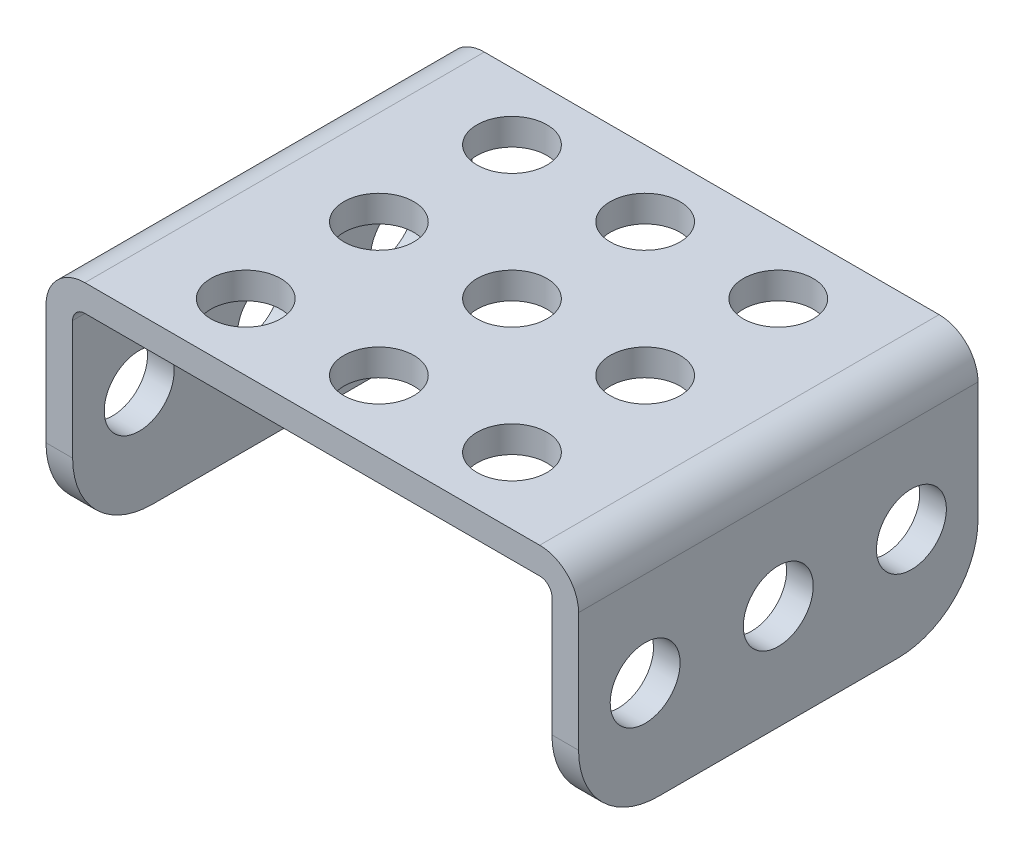
ISO-10303-21;
HEADER;
FILE_DESCRIPTION(('STEP AP214'),'2;1');
FILE_NAME('part.step','',(''),(''),'','','');
FILE_SCHEMA(('AUTOMOTIVE_DESIGN { 1 0 10303 214 1 1 1 1 }'));
ENDSEC;
DATA;
#1=APPLICATION_CONTEXT('core data for automotive mechanical design processes');
#2=APPLICATION_PROTOCOL_DEFINITION('international standard','automotive_design',2000,#1);
#3=PRODUCT_CONTEXT('',#1,'mechanical');
#4=PRODUCT('Part','Part','',(#3));
#5=PRODUCT_RELATED_PRODUCT_CATEGORY('part','',(#4));
#6=PRODUCT_DEFINITION_FORMATION('','',#4);
#7=PRODUCT_DEFINITION_CONTEXT('part definition',#1,'design');
#8=PRODUCT_DEFINITION('design','',#6,#7);
#9=PRODUCT_DEFINITION_SHAPE('','',#8);
#10=(LENGTH_UNIT() NAMED_UNIT(*) SI_UNIT(.MILLI.,.METRE.));
#11=(NAMED_UNIT(*) PLANE_ANGLE_UNIT() SI_UNIT($,.RADIAN.));
#12=(NAMED_UNIT(*) SI_UNIT($,.STERADIAN.) SOLID_ANGLE_UNIT());
#13=UNCERTAINTY_MEASURE_WITH_UNIT(LENGTH_MEASURE(1.E-05),#10,'distance_accuracy_value','');
#14=(GEOMETRIC_REPRESENTATION_CONTEXT(3) GLOBAL_UNCERTAINTY_ASSIGNED_CONTEXT((#13)) GLOBAL_UNIT_ASSIGNED_CONTEXT((#10,
#11,#12)) REPRESENTATION_CONTEXT('',''));
#15=CARTESIAN_POINT('',(0.,0.,0.));
#16=DIRECTION('',(0.,0.,1.));
#17=DIRECTION('',(1.,0.,0.));
#18=AXIS2_PLACEMENT_3D('',#15,#16,#17);
#19=CARTESIAN_POINT('',(0.863400000000006,-2.3366,0.));
#20=DIRECTION('',(0.,0.,1.));
#21=DIRECTION('',(1.,0.,0.));
#22=AXIS2_PLACEMENT_3D('',#19,#20,#21);
#23=CYLINDRICAL_SURFACE('',#22,0.7366);
#24=DIRECTION('',(0.,0.,1.));
#25=VECTOR('',#24,1.);
#26=CARTESIAN_POINT('',(0.863400000000005,-1.6,-25.6));
#27=LINE('',#26,#25);
#28=CARTESIAN_POINT('',(0.863400000000005,-1.6,-0.799999999999999));
#29=VERTEX_POINT('',#28);
#30=CARTESIAN_POINT('',(0.863400000000004,-1.6,-24.8));
#31=VERTEX_POINT('',#30);
#32=EDGE_CURVE('E138',#29,#31,#27,.F.);
#33=ORIENTED_EDGE('',*,*,#32,.T.);
#34=CARTESIAN_POINT('',(0.863400000000003,-2.3366,-24.8));
#35=DIRECTION('',(0.,0.,1.));
#36=DIRECTION('',(1.,0.,0.));
#37=AXIS2_PLACEMENT_3D('',#34,#35,#36);
#38=CIRCLE('',#37,0.7366);
#39=CARTESIAN_POINT('',(1.6,-2.3366,-24.8));
#40=VERTEX_POINT('',#39);
#41=EDGE_CURVE('E19',#40,#31,#38,.T.);
#42=ORIENTED_EDGE('',*,*,#41,.F.);
#43=DIRECTION('',(0.,0.,1.));
#44=VECTOR('',#43,1.);
#45=CARTESIAN_POINT('',(1.60000000000001,-2.3366,0.));
#46=LINE('',#45,#44);
#47=CARTESIAN_POINT('',(1.60000000000002,-2.3366,-0.799999999999999));
#48=VERTEX_POINT('',#47);
#49=EDGE_CURVE('E188',#40,#48,#46,.T.);
#50=ORIENTED_EDGE('',*,*,#49,.T.);
#51=CARTESIAN_POINT('',(0.863400000000006,-2.3366,-0.799999999999999));
#52=DIRECTION('',(0.,0.,1.));
#53=DIRECTION('',(1.,0.,0.));
#54=AXIS2_PLACEMENT_3D('',#51,#52,#53);
#55=CIRCLE('',#54,0.7366);
#56=EDGE_CURVE('E136',#29,#48,#55,.F.);
#57=ORIENTED_EDGE('',*,*,#56,.F.);
#58=EDGE_LOOP('',(#33,#42,#50,#57));
#59=FACE_BOUND('',#58,.T.);
#60=ADVANCED_FACE('F16',(#59),#23,.F.);
#61=CARTESIAN_POINT('',(-26.4634,-2.3366,-25.6));
#62=DIRECTION('',(0.,0.,-1.));
#63=DIRECTION('',(-1.,0.,0.));
#64=AXIS2_PLACEMENT_3D('',#61,#62,#63);
#65=CYLINDRICAL_SURFACE('',#64,0.736599999999997);
#66=DIRECTION('',(0.,0.,1.));
#67=VECTOR('',#66,1.);
#68=CARTESIAN_POINT('',(-27.2,-2.3366,-25.6));
#69=LINE('',#68,#67);
#70=CARTESIAN_POINT('',(-27.2,-2.3366,-0.799999999999999));
#71=VERTEX_POINT('',#70);
#72=CARTESIAN_POINT('',(-27.2,-2.3366,-24.8));
#73=VERTEX_POINT('',#72);
#74=EDGE_CURVE('E179',#71,#73,#69,.F.);
#75=ORIENTED_EDGE('',*,*,#74,.T.);
#76=CARTESIAN_POINT('',(-26.4634,-2.3366,-24.8));
#77=DIRECTION('',(0.,0.,-1.));
#78=DIRECTION('',(-1.,0.,0.));
#79=AXIS2_PLACEMENT_3D('',#76,#77,#78);
#80=CIRCLE('',#79,0.736599999999997);
#81=CARTESIAN_POINT('',(-26.4634,-1.6,-24.8));
#82=VERTEX_POINT('',#81);
#83=EDGE_CURVE('E325',#82,#73,#80,.F.);
#84=ORIENTED_EDGE('',*,*,#83,.F.);
#85=DIRECTION('',(0.,0.,1.));
#86=VECTOR('',#85,1.);
#87=CARTESIAN_POINT('',(-26.4634,-1.6,-25.6));
#88=LINE('',#87,#86);
#89=CARTESIAN_POINT('',(-26.4634,-1.6,-0.799999999999999));
#90=VERTEX_POINT('',#89);
#91=EDGE_CURVE('E142',#82,#90,#88,.T.);
#92=ORIENTED_EDGE('',*,*,#91,.T.);
#93=CARTESIAN_POINT('',(-26.4634,-2.3366,-0.799999999999999));
#94=DIRECTION('',(0.,0.,-1.));
#95=DIRECTION('',(-1.,0.,0.));
#96=AXIS2_PLACEMENT_3D('',#93,#94,#95);
#97=CIRCLE('',#96,0.736599999999997);
#98=EDGE_CURVE('E209',#71,#90,#97,.T.);
#99=ORIENTED_EDGE('',*,*,#98,.F.);
#100=EDGE_LOOP('',(#75,#84,#92,#99));
#101=FACE_BOUND('',#100,.T.);
#102=ADVANCED_FACE('F708',(#101),#65,.F.);
#103=CARTESIAN_POINT('',(3.20000000000007,-8.00000000000012,-12.8));
#104=DIRECTION('',(-1.,0.,0.));
#105=DIRECTION('',(0.,-1.,0.));
#106=AXIS2_PLACEMENT_3D('',#103,#104,#105);
#107=CYLINDRICAL_SURFACE('',#106,2.1);
#108=CARTESIAN_POINT('',(-27.2,-8.00000000000001,-12.8));
#109=DIRECTION('',(-1.,0.,0.));
#110=DIRECTION('',(0.,-1.,0.));
#111=AXIS2_PLACEMENT_3D('',#108,#109,#110);
#112=CIRCLE('',#111,2.1);
#113=CARTESIAN_POINT('',(-27.2,-10.1,-12.8));
#114=VERTEX_POINT('',#113);
#115=EDGE_CURVE('E306',#114,#114,#112,.F.);
#116=ORIENTED_EDGE('',*,*,#115,.T.);
#117=EDGE_LOOP('',(#116));
#118=FACE_BOUND('',#117,.T.);
#119=CARTESIAN_POINT('',(-28.8,-8.,-12.8));
#120=DIRECTION('',(-1.,0.,0.));
#121=DIRECTION('',(0.,-1.,0.));
#122=AXIS2_PLACEMENT_3D('',#119,#120,#121);
#123=CIRCLE('',#122,2.1);
#124=CARTESIAN_POINT('',(-28.8,-10.1,-12.8));
#125=VERTEX_POINT('',#124);
#126=EDGE_CURVE('E297',#125,#125,#123,.F.);
#127=ORIENTED_EDGE('',*,*,#126,.F.);
#128=EDGE_LOOP('',(#127));
#129=FACE_BOUND('',#128,.T.);
#130=ADVANCED_FACE('F699',(#118,#129),#107,.F.);
#131=CARTESIAN_POINT('',(3.20000000000007,-8.00000000000012,-4.80000000000002));
#132=DIRECTION('',(-1.,0.,0.));
#133=DIRECTION('',(0.,-1.,0.));
#134=AXIS2_PLACEMENT_3D('',#131,#132,#133);
#135=CYLINDRICAL_SURFACE('',#134,2.1);
#136=CARTESIAN_POINT('',(-27.2,-8.00000000000001,-4.80000000000001));
#137=DIRECTION('',(-1.,0.,0.));
#138=DIRECTION('',(0.,-1.,0.));
#139=AXIS2_PLACEMENT_3D('',#136,#137,#138);
#140=CIRCLE('',#139,2.1);
#141=CARTESIAN_POINT('',(-27.2,-10.1,-4.80000000000001));
#142=VERTEX_POINT('',#141);
#143=EDGE_CURVE('E303',#142,#142,#140,.F.);
#144=ORIENTED_EDGE('',*,*,#143,.T.);
#145=EDGE_LOOP('',(#144));
#146=FACE_BOUND('',#145,.T.);
#147=CARTESIAN_POINT('',(-28.8,-8.00000000000001,-4.80000000000001));
#148=DIRECTION('',(-1.,0.,0.));
#149=DIRECTION('',(0.,-1.,0.));
#150=AXIS2_PLACEMENT_3D('',#147,#148,#149);
#151=CIRCLE('',#150,2.1);
#152=CARTESIAN_POINT('',(-28.8,-10.1,-4.80000000000001));
#153=VERTEX_POINT('',#152);
#154=EDGE_CURVE('E294',#153,#153,#151,.F.);
#155=ORIENTED_EDGE('',*,*,#154,.F.);
#156=EDGE_LOOP('',(#155));
#157=FACE_BOUND('',#156,.T.);
#158=ADVANCED_FACE('F690',(#146,#157),#135,.F.);
#159=CARTESIAN_POINT('',(3.20000000000007,-8.00000000000012,-20.8));
#160=DIRECTION('',(-1.,0.,0.));
#161=DIRECTION('',(0.,-1.,0.));
#162=AXIS2_PLACEMENT_3D('',#159,#160,#161);
#163=CYLINDRICAL_SURFACE('',#162,2.1);
#164=CARTESIAN_POINT('',(-27.2,-8.00000000000001,-20.8));
#165=DIRECTION('',(-1.,0.,0.));
#166=DIRECTION('',(0.,-1.,0.));
#167=AXIS2_PLACEMENT_3D('',#164,#165,#166);
#168=CIRCLE('',#167,2.1);
#169=CARTESIAN_POINT('',(-27.2,-10.1,-20.8));
#170=VERTEX_POINT('',#169);
#171=EDGE_CURVE('E300',#170,#170,#168,.F.);
#172=ORIENTED_EDGE('',*,*,#171,.T.);
#173=EDGE_LOOP('',(#172));
#174=FACE_BOUND('',#173,.T.);
#175=CARTESIAN_POINT('',(-28.8,-8.00000000000001,-20.8));
#176=DIRECTION('',(-1.,0.,0.));
#177=DIRECTION('',(0.,-1.,0.));
#178=AXIS2_PLACEMENT_3D('',#175,#176,#177);
#179=CIRCLE('',#178,2.1);
#180=CARTESIAN_POINT('',(-28.8,-10.1,-20.8));
#181=VERTEX_POINT('',#180);
#182=EDGE_CURVE('E291',#181,#181,#179,.F.);
#183=ORIENTED_EDGE('',*,*,#182,.F.);
#184=EDGE_LOOP('',(#183));
#185=FACE_BOUND('',#184,.T.);
#186=ADVANCED_FACE('F681',(#174,#185),#163,.F.);
#187=CARTESIAN_POINT('',(-28.8,-9.5,-20.));
#188=DIRECTION('',(-1.,0.,0.));
#189=DIRECTION('',(0.,-1.,0.));
#190=AXIS2_PLACEMENT_3D('',#187,#188,#189);
#191=CYLINDRICAL_SURFACE('',#190,4.8);
#192=CARTESIAN_POINT('',(-28.8,-9.5,-20.));
#193=DIRECTION('',(-1.,0.,0.));
#194=DIRECTION('',(0.,-1.,0.));
#195=AXIS2_PLACEMENT_3D('',#192,#193,#194);
#196=CIRCLE('',#195,4.8);
#197=CARTESIAN_POINT('',(-28.8,-9.5,-24.8));
#198=VERTEX_POINT('',#197);
#199=CARTESIAN_POINT('',(-28.8000000000001,-14.3,-20.));
#200=VERTEX_POINT('',#199);
#201=EDGE_CURVE('E175',#198,#200,#196,.T.);
#202=ORIENTED_EDGE('',*,*,#201,.F.);
#203=DIRECTION('',(-1.,0.,0.));
#204=VECTOR('',#203,1.);
#205=CARTESIAN_POINT('',(-28.8,-9.5,-24.8));
#206=LINE('',#205,#204);
#207=CARTESIAN_POINT('',(-27.2,-9.50000000000001,-24.8));
#208=VERTEX_POINT('',#207);
#209=EDGE_CURVE('E207',#198,#208,#206,.F.);
#210=ORIENTED_EDGE('',*,*,#209,.T.);
#211=CARTESIAN_POINT('',(-27.2,-9.50000000000001,-20.));
#212=DIRECTION('',(-1.,0.,0.));
#213=DIRECTION('',(0.,-1.,0.));
#214=AXIS2_PLACEMENT_3D('',#211,#212,#213);
#215=CIRCLE('',#214,4.8);
#216=CARTESIAN_POINT('',(-27.2,-14.3,-20.));
#217=VERTEX_POINT('',#216);
#218=EDGE_CURVE('E181',#208,#217,#215,.T.);
#219=ORIENTED_EDGE('',*,*,#218,.T.);
#220=DIRECTION('',(1.,0.,0.));
#221=VECTOR('',#220,1.);
#222=CARTESIAN_POINT('',(-28.8,-14.3,-20.));
#223=LINE('',#222,#221);
#224=EDGE_CURVE('E203',#200,#217,#223,.T.);
#225=ORIENTED_EDGE('',*,*,#224,.F.);
#226=EDGE_LOOP('',(#202,#210,#219,#225));
#227=FACE_BOUND('',#226,.T.);
#228=ADVANCED_FACE('F672',(#227),#191,.T.);
#229=CARTESIAN_POINT('',(-28.8,-14.3,-25.6));
#230=DIRECTION('',(0.,-1.,0.));
#231=DIRECTION('',(1.,0.,0.));
#232=AXIS2_PLACEMENT_3D('',#229,#230,#231);
#233=PLANE('',#232);
#234=DIRECTION('',(0.,0.,1.));
#235=VECTOR('',#234,1.);
#236=CARTESIAN_POINT('',(-28.8000000000001,-14.3,-25.6));
#237=LINE('',#236,#235);
#238=CARTESIAN_POINT('',(-28.8,-14.3,-5.6));
#239=VERTEX_POINT('',#238);
#240=EDGE_CURVE('E171',#200,#239,#237,.T.);
#241=ORIENTED_EDGE('',*,*,#240,.F.);
#242=ORIENTED_EDGE('',*,*,#224,.T.);
#243=DIRECTION('',(0.,0.,1.));
#244=VECTOR('',#243,1.);
#245=CARTESIAN_POINT('',(-27.2,-14.3,-25.6));
#246=LINE('',#245,#244);
#247=CARTESIAN_POINT('',(-27.2,-14.3,-5.6));
#248=VERTEX_POINT('',#247);
#249=EDGE_CURVE('E176',#217,#248,#246,.T.);
#250=ORIENTED_EDGE('',*,*,#249,.T.);
#251=DIRECTION('',(-1.,0.,0.));
#252=VECTOR('',#251,1.);
#253=CARTESIAN_POINT('',(-28.8,-14.3,-5.6));
#254=LINE('',#253,#252);
#255=EDGE_CURVE('E200',#239,#248,#254,.F.);
#256=ORIENTED_EDGE('',*,*,#255,.F.);
#257=EDGE_LOOP('',(#241,#242,#250,#256));
#258=FACE_BOUND('',#257,.T.);
#259=ADVANCED_FACE('F663',(#258),#233,.T.);
#260=CARTESIAN_POINT('',(-28.8,-9.5,-5.6));
#261=DIRECTION('',(-1.,0.,0.));
#262=DIRECTION('',(0.,-1.,0.));
#263=AXIS2_PLACEMENT_3D('',#260,#261,#262);
#264=CYLINDRICAL_SURFACE('',#263,4.8);
#265=CARTESIAN_POINT('',(-28.8,-9.5,-5.6));
#266=DIRECTION('',(-1.,0.,0.));
#267=DIRECTION('',(0.,-1.,0.));
#268=AXIS2_PLACEMENT_3D('',#265,#266,#267);
#269=CIRCLE('',#268,4.8);
#270=CARTESIAN_POINT('',(-28.8,-9.5,-0.8));
#271=VERTEX_POINT('',#270);
#272=EDGE_CURVE('E174',#239,#271,#269,.T.);
#273=ORIENTED_EDGE('',*,*,#272,.F.);
#274=ORIENTED_EDGE('',*,*,#255,.T.);
#275=CARTESIAN_POINT('',(-27.2,-9.50000000000001,-5.6));
#276=DIRECTION('',(-1.,0.,0.));
#277=DIRECTION('',(0.,-1.,0.));
#278=AXIS2_PLACEMENT_3D('',#275,#276,#277);
#279=CIRCLE('',#278,4.8);
#280=CARTESIAN_POINT('',(-27.2,-9.50000000000001,-0.8));
#281=VERTEX_POINT('',#280);
#282=EDGE_CURVE('E178',#248,#281,#279,.T.);
#283=ORIENTED_EDGE('',*,*,#282,.T.);
#284=DIRECTION('',(-1.,0.,0.));
#285=VECTOR('',#284,1.);
#286=CARTESIAN_POINT('',(-28.8,-9.5,-0.8));
#287=LINE('',#286,#285);
#288=EDGE_CURVE('E201',#281,#271,#287,.T.);
#289=ORIENTED_EDGE('',*,*,#288,.T.);
#290=EDGE_LOOP('',(#273,#274,#283,#289));
#291=FACE_BOUND('',#290,.T.);
#292=ADVANCED_FACE('F654',(#291),#264,.T.);
#293=CARTESIAN_POINT('',(3.20000000000007,-8.00000000000012,-12.8));
#294=DIRECTION('',(-1.,0.,0.));
#295=DIRECTION('',(0.,-1.,0.));
#296=AXIS2_PLACEMENT_3D('',#293,#294,#295);
#297=CYLINDRICAL_SURFACE('',#296,2.1);
#298=CARTESIAN_POINT('',(1.60000000000004,-8.00000000000012,-12.8));
#299=DIRECTION('',(-1.,0.,0.));
#300=DIRECTION('',(0.,-1.,0.));
#301=AXIS2_PLACEMENT_3D('',#298,#299,#300);
#302=CIRCLE('',#301,2.1);
#303=CARTESIAN_POINT('',(1.60000000000003,-10.1000000000001,-12.8));
#304=VERTEX_POINT('',#303);
#305=EDGE_CURVE('E318',#304,#304,#302,.T.);
#306=ORIENTED_EDGE('',*,*,#305,.T.);
#307=EDGE_LOOP('',(#306));
#308=FACE_BOUND('',#307,.T.);
#309=CARTESIAN_POINT('',(3.20000000000007,-8.00000000000012,-12.8));
#310=DIRECTION('',(-1.,0.,0.));
#311=DIRECTION('',(0.,-1.,0.));
#312=AXIS2_PLACEMENT_3D('',#309,#310,#311);
#313=CIRCLE('',#312,2.1);
#314=CARTESIAN_POINT('',(3.20000000000006,-10.1000000000001,-12.8));
#315=VERTEX_POINT('',#314);
#316=EDGE_CURVE('E284',#315,#315,#313,.T.);
#317=ORIENTED_EDGE('',*,*,#316,.F.);
#318=EDGE_LOOP('',(#317));
#319=FACE_BOUND('',#318,.T.);
#320=ADVANCED_FACE('F645',(#308,#319),#297,.F.);
#321=CARTESIAN_POINT('',(3.20000000000007,-8.00000000000012,-4.80000000000002));
#322=DIRECTION('',(-1.,0.,0.));
#323=DIRECTION('',(0.,-1.,0.));
#324=AXIS2_PLACEMENT_3D('',#321,#322,#323);
#325=CYLINDRICAL_SURFACE('',#324,2.1);
#326=CARTESIAN_POINT('',(1.60000000000004,-8.00000000000012,-4.80000000000002));
#327=DIRECTION('',(-1.,0.,0.));
#328=DIRECTION('',(0.,-1.,0.));
#329=AXIS2_PLACEMENT_3D('',#326,#327,#328);
#330=CIRCLE('',#329,2.1);
#331=CARTESIAN_POINT('',(1.60000000000003,-10.1000000000001,-4.80000000000002));
#332=VERTEX_POINT('',#331);
#333=EDGE_CURVE('E315',#332,#332,#330,.T.);
#334=ORIENTED_EDGE('',*,*,#333,.T.);
#335=EDGE_LOOP('',(#334));
#336=FACE_BOUND('',#335,.T.);
#337=CARTESIAN_POINT('',(3.20000000000007,-8.00000000000012,-4.80000000000002));
#338=DIRECTION('',(-1.,0.,0.));
#339=DIRECTION('',(0.,-1.,0.));
#340=AXIS2_PLACEMENT_3D('',#337,#338,#339);
#341=CIRCLE('',#340,2.1);
#342=CARTESIAN_POINT('',(3.20000000000007,-10.1000000000001,-4.80000000000002));
#343=VERTEX_POINT('',#342);
#344=EDGE_CURVE('E281',#343,#343,#341,.T.);
#345=ORIENTED_EDGE('',*,*,#344,.F.);
#346=EDGE_LOOP('',(#345));
#347=FACE_BOUND('',#346,.T.);
#348=ADVANCED_FACE('F636',(#336,#347),#325,.F.);
#349=CARTESIAN_POINT('',(3.20000000000007,-8.00000000000012,-20.8));
#350=DIRECTION('',(-1.,0.,0.));
#351=DIRECTION('',(0.,-1.,0.));
#352=AXIS2_PLACEMENT_3D('',#349,#350,#351);
#353=CYLINDRICAL_SURFACE('',#352,2.1);
#354=CARTESIAN_POINT('',(1.60000000000004,-8.00000000000012,-20.8));
#355=DIRECTION('',(-1.,0.,0.));
#356=DIRECTION('',(0.,-1.,0.));
#357=AXIS2_PLACEMENT_3D('',#354,#355,#356);
#358=CIRCLE('',#357,2.1);
#359=CARTESIAN_POINT('',(1.60000000000003,-10.1000000000001,-20.8));
#360=VERTEX_POINT('',#359);
#361=EDGE_CURVE('E143',#360,#360,#358,.T.);
#362=ORIENTED_EDGE('',*,*,#361,.T.);
#363=EDGE_LOOP('',(#362));
#364=FACE_BOUND('',#363,.T.);
#365=CARTESIAN_POINT('',(3.20000000000007,-8.00000000000012,-20.8));
#366=DIRECTION('',(-1.,0.,0.));
#367=DIRECTION('',(0.,-1.,0.));
#368=AXIS2_PLACEMENT_3D('',#365,#366,#367);
#369=CIRCLE('',#368,2.1);
#370=CARTESIAN_POINT('',(3.20000000000006,-10.1000000000001,-20.8));
#371=VERTEX_POINT('',#370);
#372=EDGE_CURVE('E278',#371,#371,#369,.T.);
#373=ORIENTED_EDGE('',*,*,#372,.F.);
#374=EDGE_LOOP('',(#373));
#375=FACE_BOUND('',#374,.T.);
#376=ADVANCED_FACE('F628',(#364,#375),#353,.F.);
#377=CARTESIAN_POINT('',(3.20000000000003,-9.5,-5.6));
#378=DIRECTION('',(1.,0.,0.));
#379=DIRECTION('',(0.,1.,0.));
#380=AXIS2_PLACEMENT_3D('',#377,#378,#379);
#381=CYLINDRICAL_SURFACE('',#380,4.8);
#382=CARTESIAN_POINT('',(3.20000000000003,-9.5,-5.6));
#383=DIRECTION('',(1.,0.,0.));
#384=DIRECTION('',(0.,1.,0.));
#385=AXIS2_PLACEMENT_3D('',#382,#383,#384);
#386=CIRCLE('',#385,4.8);
#387=CARTESIAN_POINT('',(3.20000000000002,-9.5,-0.799999999999998));
#388=VERTEX_POINT('',#387);
#389=CARTESIAN_POINT('',(3.20000000000005,-14.3,-5.6));
#390=VERTEX_POINT('',#389);
#391=EDGE_CURVE('E161',#388,#390,#386,.T.);
#392=ORIENTED_EDGE('',*,*,#391,.F.);
#393=DIRECTION('',(1.,0.,0.));
#394=VECTOR('',#393,1.);
#395=CARTESIAN_POINT('',(3.20000000000003,-9.5,-0.799999999999998));
#396=LINE('',#395,#394);
#397=CARTESIAN_POINT('',(1.60000000000003,-9.50000000000001,-0.799999999999998));
#398=VERTEX_POINT('',#397);
#399=EDGE_CURVE('E198',#388,#398,#396,.F.);
#400=ORIENTED_EDGE('',*,*,#399,.T.);
#401=CARTESIAN_POINT('',(1.60000000000003,-9.50000000000001,-5.6));
#402=DIRECTION('',(1.,0.,0.));
#403=DIRECTION('',(0.,1.,0.));
#404=AXIS2_PLACEMENT_3D('',#401,#402,#403);
#405=CIRCLE('',#404,4.8);
#406=CARTESIAN_POINT('',(1.60000000000005,-14.3,-5.6));
#407=VERTEX_POINT('',#406);
#408=EDGE_CURVE('E187',#398,#407,#405,.T.);
#409=ORIENTED_EDGE('',*,*,#408,.T.);
#410=DIRECTION('',(1.,0.,0.));
#411=VECTOR('',#410,1.);
#412=CARTESIAN_POINT('',(3.20000000000005,-14.3,-5.6));
#413=LINE('',#412,#411);
#414=EDGE_CURVE('E195',#390,#407,#413,.F.);
#415=ORIENTED_EDGE('',*,*,#414,.F.);
#416=EDGE_LOOP('',(#392,#400,#409,#415));
#417=FACE_BOUND('',#416,.T.);
#418=ADVANCED_FACE('F375',(#417),#381,.T.);
#419=CARTESIAN_POINT('',(3.20000000000005,-14.3,0.));
#420=DIRECTION('',(0.,-1.,0.));
#421=DIRECTION('',(1.,0.,0.));
#422=AXIS2_PLACEMENT_3D('',#419,#420,#421);
#423=PLANE('',#422);
#424=DIRECTION('',(0.,0.,1.));
#425=VECTOR('',#424,1.);
#426=CARTESIAN_POINT('',(1.60000000000005,-14.3,0.));
#427=LINE('',#426,#425);
#428=CARTESIAN_POINT('',(1.60000000000005,-14.3,-20.));
#429=VERTEX_POINT('',#428);
#430=EDGE_CURVE('E184',#407,#429,#427,.F.);
#431=ORIENTED_EDGE('',*,*,#430,.T.);
#432=DIRECTION('',(-1.,0.,0.));
#433=VECTOR('',#432,1.);
#434=CARTESIAN_POINT('',(3.20000000000005,-14.3,-20.));
#435=LINE('',#434,#433);
#436=CARTESIAN_POINT('',(3.20000000000003,-14.3,-20.));
#437=VERTEX_POINT('',#436);
#438=EDGE_CURVE('E192',#437,#429,#435,.T.);
#439=ORIENTED_EDGE('',*,*,#438,.F.);
#440=DIRECTION('',(0.,0.,1.));
#441=VECTOR('',#440,1.);
#442=CARTESIAN_POINT('',(3.20000000000005,-14.3,0.));
#443=LINE('',#442,#441);
#444=EDGE_CURVE('E157',#390,#437,#443,.F.);
#445=ORIENTED_EDGE('',*,*,#444,.F.);
#446=ORIENTED_EDGE('',*,*,#414,.T.);
#447=EDGE_LOOP('',(#431,#439,#445,#446));
#448=FACE_BOUND('',#447,.T.);
#449=ADVANCED_FACE('F378',(#448),#423,.T.);
#450=CARTESIAN_POINT('',(3.20000000000003,-9.5,-20.));
#451=DIRECTION('',(-1.,0.,0.));
#452=DIRECTION('',(0.,-1.,0.));
#453=AXIS2_PLACEMENT_3D('',#450,#451,#452);
#454=CYLINDRICAL_SURFACE('',#453,4.8);
#455=CARTESIAN_POINT('',(1.60000000000003,-9.50000000000001,-20.));
#456=DIRECTION('',(-1.,0.,0.));
#457=DIRECTION('',(0.,-1.,0.));
#458=AXIS2_PLACEMENT_3D('',#455,#456,#457);
#459=CIRCLE('',#458,4.8);
#460=CARTESIAN_POINT('',(1.60000000000002,-9.50000000000001,-24.8));
#461=VERTEX_POINT('',#460);
#462=EDGE_CURVE('E186',#429,#461,#459,.F.);
#463=ORIENTED_EDGE('',*,*,#462,.T.);
#464=DIRECTION('',(-1.,0.,0.));
#465=VECTOR('',#464,1.);
#466=CARTESIAN_POINT('',(3.20000000000003,-9.5,-24.8));
#467=LINE('',#466,#465);
#468=CARTESIAN_POINT('',(3.2,-9.5,-24.8));
#469=VERTEX_POINT('',#468);
#470=EDGE_CURVE('E190',#461,#469,#467,.F.);
#471=ORIENTED_EDGE('',*,*,#470,.T.);
#472=CARTESIAN_POINT('',(3.2,-9.5,-20.));
#473=DIRECTION('',(-1.,0.,0.));
#474=DIRECTION('',(0.,-1.,0.));
#475=AXIS2_PLACEMENT_3D('',#472,#473,#474);
#476=CIRCLE('',#475,4.8);
#477=EDGE_CURVE('E160',#437,#469,#476,.F.);
#478=ORIENTED_EDGE('',*,*,#477,.F.);
#479=ORIENTED_EDGE('',*,*,#438,.T.);
#480=EDGE_LOOP('',(#463,#471,#478,#479));
#481=FACE_BOUND('',#480,.T.);
#482=ADVANCED_FACE('F381',(#481),#454,.T.);
#483=CARTESIAN_POINT('',(1.6,-1.6,0.));
#484=DIRECTION('',(1.,0.,0.));
#485=DIRECTION('',(0.,1.,0.));
#486=AXIS2_PLACEMENT_3D('',#483,#484,#485);
#487=PLANE('',#486);
#488=ORIENTED_EDGE('',*,*,#361,.F.);
#489=EDGE_LOOP('',(#488));
#490=FACE_BOUND('',#489,.T.);
#491=ORIENTED_EDGE('',*,*,#333,.F.);
#492=EDGE_LOOP('',(#491));
#493=FACE_BOUND('',#492,.T.);
#494=ORIENTED_EDGE('',*,*,#305,.F.);
#495=EDGE_LOOP('',(#494));
#496=FACE_BOUND('',#495,.T.);
#497=ORIENTED_EDGE('',*,*,#430,.F.);
#498=ORIENTED_EDGE('',*,*,#408,.F.);
#499=DIRECTION('',(0.,1.,0.));
#500=VECTOR('',#499,1.);
#501=CARTESIAN_POINT('',(1.60000000000003,-14.3,-0.799999999999999));
#502=LINE('',#501,#500);
#503=EDGE_CURVE('E169',#398,#48,#502,.T.);
#504=ORIENTED_EDGE('',*,*,#503,.T.);
#505=ORIENTED_EDGE('',*,*,#49,.F.);
#506=DIRECTION('',(0.,1.,0.));
#507=VECTOR('',#506,1.);
#508=CARTESIAN_POINT('',(1.6,-14.3,-24.8));
#509=LINE('',#508,#507);
#510=EDGE_CURVE('E135',#40,#461,#509,.F.);
#511=ORIENTED_EDGE('',*,*,#510,.T.);
#512=ORIENTED_EDGE('',*,*,#462,.F.);
#513=EDGE_LOOP('',(#497,#498,#504,#505,#511,#512));
#514=FACE_BOUND('',#513,.T.);
#515=ADVANCED_FACE('F333',(#490,#493,#496,#514),#487,.F.);
#516=CARTESIAN_POINT('',(0.,-1.6,-25.6));
#517=DIRECTION('',(0.,1.,0.));
#518=DIRECTION('',(0.,0.,1.));
#519=AXIS2_PLACEMENT_3D('',#516,#517,#518);
#520=PLANE('',#519);
#521=CARTESIAN_POINT('',(-4.8,-1.6,-20.8));
#522=DIRECTION('',(0.,1.,0.));
#523=DIRECTION('',(0.,0.,1.));
#524=AXIS2_PLACEMENT_3D('',#521,#522,#523);
#525=CIRCLE('',#524,2.09999999999999);
#526=CARTESIAN_POINT('',(-4.8,-1.6,-18.7));
#527=VERTEX_POINT('',#526);
#528=EDGE_CURVE('E153',#527,#527,#525,.T.);
#529=ORIENTED_EDGE('',*,*,#528,.T.);
#530=EDGE_LOOP('',(#529));
#531=FACE_BOUND('',#530,.T.);
#532=CARTESIAN_POINT('',(-4.8,-1.6,-12.8));
#533=DIRECTION('',(0.,1.,0.));
#534=DIRECTION('',(0.,0.,1.));
#535=AXIS2_PLACEMENT_3D('',#532,#533,#534);
#536=CIRCLE('',#535,2.09999999999999);
#537=CARTESIAN_POINT('',(-4.8,-1.6,-10.7));
#538=VERTEX_POINT('',#537);
#539=EDGE_CURVE('E250',#538,#538,#536,.T.);
#540=ORIENTED_EDGE('',*,*,#539,.T.);
#541=EDGE_LOOP('',(#540));
#542=FACE_BOUND('',#541,.T.);
#543=CARTESIAN_POINT('',(-4.8,-1.6,-4.8));
#544=DIRECTION('',(0.,1.,0.));
#545=DIRECTION('',(0.,0.,1.));
#546=AXIS2_PLACEMENT_3D('',#543,#544,#545);
#547=CIRCLE('',#546,2.09999999999999);
#548=CARTESIAN_POINT('',(-4.8,-1.6,-2.70000000000001));
#549=VERTEX_POINT('',#548);
#550=EDGE_CURVE('E253',#549,#549,#547,.T.);
#551=ORIENTED_EDGE('',*,*,#550,.T.);
#552=EDGE_LOOP('',(#551));
#553=FACE_BOUND('',#552,.T.);
#554=CARTESIAN_POINT('',(-12.8,-1.6,-20.8));
#555=DIRECTION('',(0.,1.,0.));
#556=DIRECTION('',(0.,0.,1.));
#557=AXIS2_PLACEMENT_3D('',#554,#555,#556);
#558=CIRCLE('',#557,2.09999999999999);
#559=CARTESIAN_POINT('',(-12.8,-1.6,-18.7));
#560=VERTEX_POINT('',#559);
#561=EDGE_CURVE('E256',#560,#560,#558,.T.);
#562=ORIENTED_EDGE('',*,*,#561,.T.);
#563=EDGE_LOOP('',(#562));
#564=FACE_BOUND('',#563,.T.);
#565=CARTESIAN_POINT('',(-12.8,-1.6,-12.8));
#566=DIRECTION('',(0.,1.,0.));
#567=DIRECTION('',(0.,0.,1.));
#568=AXIS2_PLACEMENT_3D('',#565,#566,#567);
#569=CIRCLE('',#568,2.09999999999999);
#570=CARTESIAN_POINT('',(-12.8,-1.6,-10.7));
#571=VERTEX_POINT('',#570);
#572=EDGE_CURVE('E259',#571,#571,#569,.T.);
#573=ORIENTED_EDGE('',*,*,#572,.T.);
#574=EDGE_LOOP('',(#573));
#575=FACE_BOUND('',#574,.T.);
#576=CARTESIAN_POINT('',(-12.8,-1.6,-4.8));
#577=DIRECTION('',(0.,1.,0.));
#578=DIRECTION('',(0.,0.,1.));
#579=AXIS2_PLACEMENT_3D('',#576,#577,#578);
#580=CIRCLE('',#579,2.09999999999999);
#581=CARTESIAN_POINT('',(-12.8,-1.6,-2.70000000000001));
#582=VERTEX_POINT('',#581);
#583=EDGE_CURVE('E262',#582,#582,#580,.T.);
#584=ORIENTED_EDGE('',*,*,#583,.T.);
#585=EDGE_LOOP('',(#584));
#586=FACE_BOUND('',#585,.T.);
#587=CARTESIAN_POINT('',(-20.8,-1.6,-20.8));
#588=DIRECTION('',(0.,1.,0.));
#589=DIRECTION('',(0.,0.,1.));
#590=AXIS2_PLACEMENT_3D('',#587,#588,#589);
#591=CIRCLE('',#590,2.09999999999999);
#592=CARTESIAN_POINT('',(-20.8,-1.6,-18.7));
#593=VERTEX_POINT('',#592);
#594=EDGE_CURVE('E265',#593,#593,#591,.T.);
#595=ORIENTED_EDGE('',*,*,#594,.T.);
#596=EDGE_LOOP('',(#595));
#597=FACE_BOUND('',#596,.T.);
#598=CARTESIAN_POINT('',(-20.8,-1.6,-12.8));
#599=DIRECTION('',(0.,1.,0.));
#600=DIRECTION('',(0.,0.,1.));
#601=AXIS2_PLACEMENT_3D('',#598,#599,#600);
#602=CIRCLE('',#601,2.09999999999999);
#603=CARTESIAN_POINT('',(-20.8,-1.6,-10.7));
#604=VERTEX_POINT('',#603);
#605=EDGE_CURVE('E268',#604,#604,#602,.T.);
#606=ORIENTED_EDGE('',*,*,#605,.T.);
#607=EDGE_LOOP('',(#606));
#608=FACE_BOUND('',#607,.T.);
#609=CARTESIAN_POINT('',(-20.8,-1.6,-4.8));
#610=DIRECTION('',(0.,1.,0.));
#611=DIRECTION('',(0.,0.,1.));
#612=AXIS2_PLACEMENT_3D('',#609,#610,#611);
#613=CIRCLE('',#612,2.09999999999999);
#614=CARTESIAN_POINT('',(-20.8,-1.6,-2.70000000000001));
#615=VERTEX_POINT('',#614);
#616=EDGE_CURVE('E271',#615,#615,#613,.T.);
#617=ORIENTED_EDGE('',*,*,#616,.T.);
#618=EDGE_LOOP('',(#617));
#619=FACE_BOUND('',#618,.T.);
#620=ORIENTED_EDGE('',*,*,#91,.F.);
#621=DIRECTION('',(1.,0.,0.));
#622=VECTOR('',#621,1.);
#623=CARTESIAN_POINT('',(-28.8,-1.6,-24.8));
#624=LINE('',#623,#622);
#625=EDGE_CURVE('E133',#82,#31,#624,.T.);
#626=ORIENTED_EDGE('',*,*,#625,.T.);
#627=ORIENTED_EDGE('',*,*,#32,.F.);
#628=DIRECTION('',(-1.,0.,0.));
#629=VECTOR('',#628,1.);
#630=CARTESIAN_POINT('',(-28.8,-1.6,-0.8));
#631=LINE('',#630,#629);
#632=EDGE_CURVE('E329',#29,#90,#631,.T.);
#633=ORIENTED_EDGE('',*,*,#632,.T.);
#634=EDGE_LOOP('',(#620,#626,#627,#633));
#635=FACE_BOUND('',#634,.T.);
#636=ADVANCED_FACE('F146',(#531,#542,#553,#564,#575,#586,#597,#608,#619,#635),#520,.F.);
#637=CARTESIAN_POINT('',(-27.2,-1.6,-25.6));
#638=DIRECTION('',(-1.,0.,0.));
#639=DIRECTION('',(0.,-1.,0.));
#640=AXIS2_PLACEMENT_3D('',#637,#638,#639);
#641=PLANE('',#640);
#642=ORIENTED_EDGE('',*,*,#171,.F.);
#643=EDGE_LOOP('',(#642));
#644=FACE_BOUND('',#643,.T.);
#645=ORIENTED_EDGE('',*,*,#143,.F.);
#646=EDGE_LOOP('',(#645));
#647=FACE_BOUND('',#646,.T.);
#648=ORIENTED_EDGE('',*,*,#115,.F.);
#649=EDGE_LOOP('',(#648));
#650=FACE_BOUND('',#649,.T.);
#651=DIRECTION('',(0.,1.,0.));
#652=VECTOR('',#651,1.);
#653=CARTESIAN_POINT('',(-27.2,-14.3,-24.8));
#654=LINE('',#653,#652);
#655=EDGE_CURVE('E148',#208,#73,#654,.T.);
#656=ORIENTED_EDGE('',*,*,#655,.T.);
#657=ORIENTED_EDGE('',*,*,#74,.F.);
#658=DIRECTION('',(0.,1.,0.));
#659=VECTOR('',#658,1.);
#660=CARTESIAN_POINT('',(-27.2,-14.3,-0.8));
#661=LINE('',#660,#659);
#662=EDGE_CURVE('E335',#71,#281,#661,.F.);
#663=ORIENTED_EDGE('',*,*,#662,.T.);
#664=ORIENTED_EDGE('',*,*,#282,.F.);
#665=ORIENTED_EDGE('',*,*,#249,.F.);
#666=ORIENTED_EDGE('',*,*,#218,.F.);
#667=EDGE_LOOP('',(#656,#657,#663,#664,#665,#666));
#668=FACE_BOUND('',#667,.T.);
#669=ADVANCED_FACE('F445',(#644,#647,#650,#668),#641,.F.);
#670=CARTESIAN_POINT('',(-28.8,-1.59999999999999,-25.6));
#671=DIRECTION('',(-1.,0.,0.));
#672=DIRECTION('',(0.,-1.,0.));
#673=AXIS2_PLACEMENT_3D('',#670,#671,#672);
#674=PLANE('',#673);
#675=ORIENTED_EDGE('',*,*,#240,.T.);
#676=ORIENTED_EDGE('',*,*,#272,.T.);
#677=DIRECTION('',(0.,1.,0.));
#678=VECTOR('',#677,1.);
#679=CARTESIAN_POINT('',(-28.8,-14.3,-0.8));
#680=LINE('',#679,#678);
#681=CARTESIAN_POINT('',(-28.8,-2.3366,-0.799999999999999));
#682=VERTEX_POINT('',#681);
#683=EDGE_CURVE('E244',#271,#682,#680,.T.);
#684=ORIENTED_EDGE('',*,*,#683,.T.);
#685=DIRECTION('',(0.,0.,-1.));
#686=VECTOR('',#685,1.);
#687=CARTESIAN_POINT('',(-28.8,-2.3366,-25.6));
#688=LINE('',#687,#686);
#689=CARTESIAN_POINT('',(-28.8,-2.3366,-24.8));
#690=VERTEX_POINT('',#689);
#691=EDGE_CURVE('E166',#690,#682,#688,.F.);
#692=ORIENTED_EDGE('',*,*,#691,.F.);
#693=DIRECTION('',(0.,1.,0.));
#694=VECTOR('',#693,1.);
#695=CARTESIAN_POINT('',(-28.8,-14.3,-24.8));
#696=LINE('',#695,#694);
#697=EDGE_CURVE('E247',#690,#198,#696,.F.);
#698=ORIENTED_EDGE('',*,*,#697,.T.);
#699=ORIENTED_EDGE('',*,*,#201,.T.);
#700=EDGE_LOOP('',(#675,#676,#684,#692,#698,#699));
#701=FACE_BOUND('',#700,.T.);
#702=ORIENTED_EDGE('',*,*,#182,.T.);
#703=EDGE_LOOP('',(#702));
#704=FACE_BOUND('',#703,.T.);
#705=ORIENTED_EDGE('',*,*,#154,.T.);
#706=EDGE_LOOP('',(#705));
#707=FACE_BOUND('',#706,.T.);
#708=ORIENTED_EDGE('',*,*,#126,.T.);
#709=EDGE_LOOP('',(#708));
#710=FACE_BOUND('',#709,.T.);
#711=ADVANCED_FACE('F367',(#701,#704,#707,#710),#674,.T.);
#712=CARTESIAN_POINT('',(3.2,-1.59999999999999,0.));
#713=DIRECTION('',(1.,0.,0.));
#714=DIRECTION('',(0.,1.,0.));
#715=AXIS2_PLACEMENT_3D('',#712,#713,#714);
#716=PLANE('',#715);
#717=DIRECTION('',(0.,1.,0.));
#718=VECTOR('',#717,1.);
#719=CARTESIAN_POINT('',(3.2,-14.3,-24.8));
#720=LINE('',#719,#718);
#721=CARTESIAN_POINT('',(3.2,-2.3366,-24.8));
#722=VERTEX_POINT('',#721);
#723=EDGE_CURVE('E150',#469,#722,#720,.T.);
#724=ORIENTED_EDGE('',*,*,#723,.T.);
#725=DIRECTION('',(0.,0.,1.));
#726=VECTOR('',#725,1.);
#727=CARTESIAN_POINT('',(3.20000000000001,-2.3366,0.));
#728=LINE('',#727,#726);
#729=CARTESIAN_POINT('',(3.20000000000001,-2.3366,-0.799999999999999));
#730=VERTEX_POINT('',#729);
#731=EDGE_CURVE('E162',#730,#722,#728,.F.);
#732=ORIENTED_EDGE('',*,*,#731,.F.);
#733=DIRECTION('',(0.,1.,0.));
#734=VECTOR('',#733,1.);
#735=CARTESIAN_POINT('',(3.20000000000001,-14.3,-0.799999999999999));
#736=LINE('',#735,#734);
#737=EDGE_CURVE('E241',#730,#388,#736,.F.);
#738=ORIENTED_EDGE('',*,*,#737,.T.);
#739=ORIENTED_EDGE('',*,*,#391,.T.);
#740=ORIENTED_EDGE('',*,*,#444,.T.);
#741=ORIENTED_EDGE('',*,*,#477,.T.);
#742=EDGE_LOOP('',(#724,#732,#738,#739,#740,#741));
#743=FACE_BOUND('',#742,.T.);
#744=ORIENTED_EDGE('',*,*,#372,.T.);
#745=EDGE_LOOP('',(#744));
#746=FACE_BOUND('',#745,.T.);
#747=ORIENTED_EDGE('',*,*,#344,.T.);
#748=EDGE_LOOP('',(#747));
#749=FACE_BOUND('',#748,.T.);
#750=ORIENTED_EDGE('',*,*,#316,.T.);
#751=EDGE_LOOP('',(#750));
#752=FACE_BOUND('',#751,.T.);
#753=ADVANCED_FACE('F351',(#743,#746,#749,#752),#716,.T.);
#754=CARTESIAN_POINT('',(-20.8,-10.,-4.8));
#755=DIRECTION('',(0.,1.,0.));
#756=DIRECTION('',(0.,0.,1.));
#757=AXIS2_PLACEMENT_3D('',#754,#755,#756);
#758=CYLINDRICAL_SURFACE('',#757,2.09999999999999);
#759=ORIENTED_EDGE('',*,*,#616,.F.);
#760=EDGE_LOOP('',(#759));
#761=FACE_BOUND('',#760,.T.);
#762=CARTESIAN_POINT('',(-20.8,0.,-4.8));
#763=DIRECTION('',(0.,1.,0.));
#764=DIRECTION('',(0.,0.,1.));
#765=AXIS2_PLACEMENT_3D('',#762,#763,#764);
#766=CIRCLE('',#765,2.09999999999999);
#767=CARTESIAN_POINT('',(-20.8,0.,-2.70000000000001));
#768=VERTEX_POINT('',#767);
#769=EDGE_CURVE('E165',#768,#768,#766,.F.);
#770=ORIENTED_EDGE('',*,*,#769,.F.);
#771=EDGE_LOOP('',(#770));
#772=FACE_BOUND('',#771,.T.);
#773=ADVANCED_FACE('F436',(#761,#772),#758,.F.);
#774=CARTESIAN_POINT('',(-20.8,-10.,-12.8));
#775=DIRECTION('',(0.,1.,0.));
#776=DIRECTION('',(0.,0.,1.));
#777=AXIS2_PLACEMENT_3D('',#774,#775,#776);
#778=CYLINDRICAL_SURFACE('',#777,2.09999999999999);
#779=ORIENTED_EDGE('',*,*,#605,.F.);
#780=EDGE_LOOP('',(#779));
#781=FACE_BOUND('',#780,.T.);
#782=CARTESIAN_POINT('',(-20.8,0.,-12.8));
#783=DIRECTION('',(0.,1.,0.));
#784=DIRECTION('',(0.,0.,1.));
#785=AXIS2_PLACEMENT_3D('',#782,#783,#784);
#786=CIRCLE('',#785,2.09999999999999);
#787=CARTESIAN_POINT('',(-20.8,0.,-10.7));
#788=VERTEX_POINT('',#787);
#789=EDGE_CURVE('E232',#788,#788,#786,.F.);
#790=ORIENTED_EDGE('',*,*,#789,.F.);
#791=EDGE_LOOP('',(#790));
#792=FACE_BOUND('',#791,.T.);
#793=ADVANCED_FACE('F432',(#781,#792),#778,.F.);
#794=CARTESIAN_POINT('',(-20.8,-10.,-20.8));
#795=DIRECTION('',(0.,1.,0.));
#796=DIRECTION('',(0.,0.,1.));
#797=AXIS2_PLACEMENT_3D('',#794,#795,#796);
#798=CYLINDRICAL_SURFACE('',#797,2.09999999999999);
#799=ORIENTED_EDGE('',*,*,#594,.F.);
#800=EDGE_LOOP('',(#799));
#801=FACE_BOUND('',#800,.T.);
#802=CARTESIAN_POINT('',(-20.8,0.,-20.8));
#803=DIRECTION('',(0.,1.,0.));
#804=DIRECTION('',(0.,0.,1.));
#805=AXIS2_PLACEMENT_3D('',#802,#803,#804);
#806=CIRCLE('',#805,2.09999999999999);
#807=CARTESIAN_POINT('',(-20.8,0.,-18.7));
#808=VERTEX_POINT('',#807);
#809=EDGE_CURVE('E229',#808,#808,#806,.F.);
#810=ORIENTED_EDGE('',*,*,#809,.F.);
#811=EDGE_LOOP('',(#810));
#812=FACE_BOUND('',#811,.T.);
#813=ADVANCED_FACE('F428',(#801,#812),#798,.F.);
#814=CARTESIAN_POINT('',(-12.8,-10.,-4.8));
#815=DIRECTION('',(0.,1.,0.));
#816=DIRECTION('',(0.,0.,1.));
#817=AXIS2_PLACEMENT_3D('',#814,#815,#816);
#818=CYLINDRICAL_SURFACE('',#817,2.09999999999999);
#819=ORIENTED_EDGE('',*,*,#583,.F.);
#820=EDGE_LOOP('',(#819));
#821=FACE_BOUND('',#820,.T.);
#822=CARTESIAN_POINT('',(-12.8,0.,-4.8));
#823=DIRECTION('',(0.,1.,0.));
#824=DIRECTION('',(0.,0.,1.));
#825=AXIS2_PLACEMENT_3D('',#822,#823,#824);
#826=CIRCLE('',#825,2.09999999999999);
#827=CARTESIAN_POINT('',(-12.8,0.,-2.70000000000001));
#828=VERTEX_POINT('',#827);
#829=EDGE_CURVE('E226',#828,#828,#826,.F.);
#830=ORIENTED_EDGE('',*,*,#829,.F.);
#831=EDGE_LOOP('',(#830));
#832=FACE_BOUND('',#831,.T.);
#833=ADVANCED_FACE('F424',(#821,#832),#818,.F.);
#834=CARTESIAN_POINT('',(-12.8,-10.,-12.8));
#835=DIRECTION('',(0.,1.,0.));
#836=DIRECTION('',(0.,0.,1.));
#837=AXIS2_PLACEMENT_3D('',#834,#835,#836);
#838=CYLINDRICAL_SURFACE('',#837,2.09999999999999);
#839=ORIENTED_EDGE('',*,*,#572,.F.);
#840=EDGE_LOOP('',(#839));
#841=FACE_BOUND('',#840,.T.);
#842=CARTESIAN_POINT('',(-12.8,0.,-12.8));
#843=DIRECTION('',(0.,1.,0.));
#844=DIRECTION('',(0.,0.,1.));
#845=AXIS2_PLACEMENT_3D('',#842,#843,#844);
#846=CIRCLE('',#845,2.09999999999999);
#847=CARTESIAN_POINT('',(-12.8,0.,-10.7));
#848=VERTEX_POINT('',#847);
#849=EDGE_CURVE('E223',#848,#848,#846,.F.);
#850=ORIENTED_EDGE('',*,*,#849,.F.);
#851=EDGE_LOOP('',(#850));
#852=FACE_BOUND('',#851,.T.);
#853=ADVANCED_FACE('F420',(#841,#852),#838,.F.);
#854=CARTESIAN_POINT('',(-12.8,-10.,-20.8));
#855=DIRECTION('',(0.,1.,0.));
#856=DIRECTION('',(0.,0.,1.));
#857=AXIS2_PLACEMENT_3D('',#854,#855,#856);
#858=CYLINDRICAL_SURFACE('',#857,2.09999999999999);
#859=ORIENTED_EDGE('',*,*,#561,.F.);
#860=EDGE_LOOP('',(#859));
#861=FACE_BOUND('',#860,.T.);
#862=CARTESIAN_POINT('',(-12.8,0.,-20.8));
#863=DIRECTION('',(0.,1.,0.));
#864=DIRECTION('',(0.,0.,1.));
#865=AXIS2_PLACEMENT_3D('',#862,#863,#864);
#866=CIRCLE('',#865,2.09999999999999);
#867=CARTESIAN_POINT('',(-12.8,0.,-18.7));
#868=VERTEX_POINT('',#867);
#869=EDGE_CURVE('E220',#868,#868,#866,.F.);
#870=ORIENTED_EDGE('',*,*,#869,.F.);
#871=EDGE_LOOP('',(#870));
#872=FACE_BOUND('',#871,.T.);
#873=ADVANCED_FACE('F416',(#861,#872),#858,.F.);
#874=CARTESIAN_POINT('',(-4.8,-10.,-4.8));
#875=DIRECTION('',(0.,1.,0.));
#876=DIRECTION('',(0.,0.,1.));
#877=AXIS2_PLACEMENT_3D('',#874,#875,#876);
#878=CYLINDRICAL_SURFACE('',#877,2.09999999999999);
#879=ORIENTED_EDGE('',*,*,#550,.F.);
#880=EDGE_LOOP('',(#879));
#881=FACE_BOUND('',#880,.T.);
#882=CARTESIAN_POINT('',(-4.8,0.,-4.8));
#883=DIRECTION('',(0.,1.,0.));
#884=DIRECTION('',(0.,0.,1.));
#885=AXIS2_PLACEMENT_3D('',#882,#883,#884);
#886=CIRCLE('',#885,2.09999999999999);
#887=CARTESIAN_POINT('',(-4.8,0.,-2.70000000000001));
#888=VERTEX_POINT('',#887);
#889=EDGE_CURVE('E217',#888,#888,#886,.F.);
#890=ORIENTED_EDGE('',*,*,#889,.F.);
#891=EDGE_LOOP('',(#890));
#892=FACE_BOUND('',#891,.T.);
#893=ADVANCED_FACE('F412',(#881,#892),#878,.F.);
#894=CARTESIAN_POINT('',(-4.8,-10.,-12.8));
#895=DIRECTION('',(0.,1.,0.));
#896=DIRECTION('',(0.,0.,1.));
#897=AXIS2_PLACEMENT_3D('',#894,#895,#896);
#898=CYLINDRICAL_SURFACE('',#897,2.09999999999999);
#899=ORIENTED_EDGE('',*,*,#539,.F.);
#900=EDGE_LOOP('',(#899));
#901=FACE_BOUND('',#900,.T.);
#902=CARTESIAN_POINT('',(-4.8,0.,-12.8));
#903=DIRECTION('',(0.,1.,0.));
#904=DIRECTION('',(0.,0.,1.));
#905=AXIS2_PLACEMENT_3D('',#902,#903,#904);
#906=CIRCLE('',#905,2.09999999999999);
#907=CARTESIAN_POINT('',(-4.8,0.,-10.7));
#908=VERTEX_POINT('',#907);
#909=EDGE_CURVE('E214',#908,#908,#906,.F.);
#910=ORIENTED_EDGE('',*,*,#909,.F.);
#911=EDGE_LOOP('',(#910));
#912=FACE_BOUND('',#911,.T.);
#913=ADVANCED_FACE('F408',(#901,#912),#898,.F.);
#914=CARTESIAN_POINT('',(-4.8,-10.,-20.8));
#915=DIRECTION('',(0.,1.,0.));
#916=DIRECTION('',(0.,0.,1.));
#917=AXIS2_PLACEMENT_3D('',#914,#915,#916);
#918=CYLINDRICAL_SURFACE('',#917,2.09999999999999);
#919=ORIENTED_EDGE('',*,*,#528,.F.);
#920=EDGE_LOOP('',(#919));
#921=FACE_BOUND('',#920,.T.);
#922=CARTESIAN_POINT('',(-4.8,0.,-20.8));
#923=DIRECTION('',(0.,1.,0.));
#924=DIRECTION('',(0.,0.,1.));
#925=AXIS2_PLACEMENT_3D('',#922,#923,#924);
#926=CIRCLE('',#925,2.09999999999999);
#927=CARTESIAN_POINT('',(-4.8,0.,-18.7));
#928=VERTEX_POINT('',#927);
#929=EDGE_CURVE('E210',#928,#928,#926,.F.);
#930=ORIENTED_EDGE('',*,*,#929,.F.);
#931=EDGE_LOOP('',(#930));
#932=FACE_BOUND('',#931,.T.);
#933=ADVANCED_FACE('F405',(#921,#932),#918,.F.);
#934=CARTESIAN_POINT('',(-28.8,-14.3,-24.8));
#935=DIRECTION('',(0.,0.,1.));
#936=DIRECTION('',(1.,0.,0.));
#937=AXIS2_PLACEMENT_3D('',#934,#935,#936);
#938=PLANE('',#937);
#939=ORIENTED_EDGE('',*,*,#697,.F.);
#940=CARTESIAN_POINT('',(-26.4634,-2.3366,-24.8));
#941=DIRECTION('',(0.,0.,-1.));
#942=DIRECTION('',(-1.,0.,0.));
#943=AXIS2_PLACEMENT_3D('',#940,#941,#942);
#944=CIRCLE('',#943,2.3366);
#945=CARTESIAN_POINT('',(-26.4634,0.,-24.8));
#946=VERTEX_POINT('',#945);
#947=EDGE_CURVE('E170',#946,#690,#944,.F.);
#948=ORIENTED_EDGE('',*,*,#947,.F.);
#949=DIRECTION('',(1.,0.,0.));
#950=VECTOR('',#949,1.);
#951=CARTESIAN_POINT('',(0.,0.,-24.8));
#952=LINE('',#951,#950);
#953=CARTESIAN_POINT('',(0.863400000000005,0.,-24.8));
#954=VERTEX_POINT('',#953);
#955=EDGE_CURVE('E213',#954,#946,#952,.F.);
#956=ORIENTED_EDGE('',*,*,#955,.F.);
#957=CARTESIAN_POINT('',(0.863400000000003,-2.3366,-24.8));
#958=DIRECTION('',(0.,0.,1.));
#959=DIRECTION('',(1.,0.,0.));
#960=AXIS2_PLACEMENT_3D('',#957,#958,#959);
#961=CIRCLE('',#960,2.3366);
#962=EDGE_CURVE('E238',#722,#954,#961,.T.);
#963=ORIENTED_EDGE('',*,*,#962,.F.);
#964=ORIENTED_EDGE('',*,*,#723,.F.);
#965=ORIENTED_EDGE('',*,*,#470,.F.);
#966=ORIENTED_EDGE('',*,*,#510,.F.);
#967=ORIENTED_EDGE('',*,*,#41,.T.);
#968=ORIENTED_EDGE('',*,*,#625,.F.);
#969=ORIENTED_EDGE('',*,*,#83,.T.);
#970=ORIENTED_EDGE('',*,*,#655,.F.);
#971=ORIENTED_EDGE('',*,*,#209,.F.);
#972=EDGE_LOOP('',(#939,#948,#956,#963,#964,#965,#966,#967,#968,#969,#970,#971));
#973=FACE_BOUND('',#972,.T.);
#974=ADVANCED_FACE('F131',(#973),#938,.F.);
#975=CARTESIAN_POINT('',(-26.4634,-2.3366,-25.6));
#976=DIRECTION('',(0.,0.,-1.));
#977=DIRECTION('',(-1.,0.,0.));
#978=AXIS2_PLACEMENT_3D('',#975,#976,#977);
#979=CYLINDRICAL_SURFACE('',#978,2.3366);
#980=CARTESIAN_POINT('',(-26.4634,-2.3366,-0.799999999999999));
#981=DIRECTION('',(0.,0.,-1.));
#982=DIRECTION('',(-1.,0.,0.));
#983=AXIS2_PLACEMENT_3D('',#980,#981,#982);
#984=CIRCLE('',#983,2.3366);
#985=CARTESIAN_POINT('',(-26.4634,0.,-0.799999999999999));
#986=VERTEX_POINT('',#985);
#987=EDGE_CURVE('E242',#682,#986,#984,.T.);
#988=ORIENTED_EDGE('',*,*,#987,.T.);
#989=DIRECTION('',(0.,0.,1.));
#990=VECTOR('',#989,1.);
#991=CARTESIAN_POINT('',(-26.4634,0.,-25.6));
#992=LINE('',#991,#990);
#993=EDGE_CURVE('E339',#946,#986,#992,.T.);
#994=ORIENTED_EDGE('',*,*,#993,.F.);
#995=ORIENTED_EDGE('',*,*,#947,.T.);
#996=ORIENTED_EDGE('',*,*,#691,.T.);
#997=EDGE_LOOP('',(#988,#994,#995,#996));
#998=FACE_BOUND('',#997,.T.);
#999=ADVANCED_FACE('F364',(#998),#979,.T.);
#1000=CARTESIAN_POINT('',(-28.8,-14.3,-0.8));
#1001=DIRECTION('',(0.,0.,-1.));
#1002=DIRECTION('',(-1.,0.,0.));
#1003=AXIS2_PLACEMENT_3D('',#1000,#1001,#1002);
#1004=PLANE('',#1003);
#1005=ORIENTED_EDGE('',*,*,#737,.F.);
#1006=CARTESIAN_POINT('',(0.863400000000006,-2.3366,-0.799999999999999));
#1007=DIRECTION('',(0.,0.,1.));
#1008=DIRECTION('',(1.,0.,0.));
#1009=AXIS2_PLACEMENT_3D('',#1006,#1007,#1008);
#1010=CIRCLE('',#1009,2.3366);
#1011=CARTESIAN_POINT('',(0.863400000000007,0.,-0.799999999999999));
#1012=VERTEX_POINT('',#1011);
#1013=EDGE_CURVE('E34',#1012,#730,#1010,.F.);
#1014=ORIENTED_EDGE('',*,*,#1013,.F.);
#1015=DIRECTION('',(1.,0.,0.));
#1016=VECTOR('',#1015,1.);
#1017=CARTESIAN_POINT('',(0.,0.,-0.799999999999999));
#1018=LINE('',#1017,#1016);
#1019=EDGE_CURVE('E25',#986,#1012,#1018,.T.);
#1020=ORIENTED_EDGE('',*,*,#1019,.F.);
#1021=ORIENTED_EDGE('',*,*,#987,.F.);
#1022=ORIENTED_EDGE('',*,*,#683,.F.);
#1023=ORIENTED_EDGE('',*,*,#288,.F.);
#1024=ORIENTED_EDGE('',*,*,#662,.F.);
#1025=ORIENTED_EDGE('',*,*,#98,.T.);
#1026=ORIENTED_EDGE('',*,*,#632,.F.);
#1027=ORIENTED_EDGE('',*,*,#56,.T.);
#1028=ORIENTED_EDGE('',*,*,#503,.F.);
#1029=ORIENTED_EDGE('',*,*,#399,.F.);
#1030=EDGE_LOOP('',(#1005,#1014,#1020,#1021,#1022,#1023,#1024,#1025,#1026,#1027,#1028,#1029));
#1031=FACE_BOUND('',#1030,.T.);
#1032=ADVANCED_FACE('F327',(#1031),#1004,.F.);
#1033=CARTESIAN_POINT('',(0.863400000000006,-2.3366,0.));
#1034=DIRECTION('',(0.,0.,1.));
#1035=DIRECTION('',(1.,0.,0.));
#1036=AXIS2_PLACEMENT_3D('',#1033,#1034,#1035);
#1037=CYLINDRICAL_SURFACE('',#1036,2.3366);
#1038=ORIENTED_EDGE('',*,*,#1013,.T.);
#1039=ORIENTED_EDGE('',*,*,#731,.T.);
#1040=ORIENTED_EDGE('',*,*,#962,.T.);
#1041=DIRECTION('',(0.,0.,1.));
#1042=VECTOR('',#1041,1.);
#1043=CARTESIAN_POINT('',(0.863400000000007,0.,-25.6));
#1044=LINE('',#1043,#1042);
#1045=EDGE_CURVE('E11',#1012,#954,#1044,.F.);
#1046=ORIENTED_EDGE('',*,*,#1045,.F.);
#1047=EDGE_LOOP('',(#1038,#1039,#1040,#1046));
#1048=FACE_BOUND('',#1047,.T.);
#1049=ADVANCED_FACE('F356',(#1048),#1037,.T.);
#1050=CARTESIAN_POINT('',(0.,0.,-25.6));
#1051=DIRECTION('',(0.,1.,0.));
#1052=DIRECTION('',(0.,0.,1.));
#1053=AXIS2_PLACEMENT_3D('',#1050,#1051,#1052);
#1054=PLANE('',#1053);
#1055=ORIENTED_EDGE('',*,*,#1019,.T.);
#1056=ORIENTED_EDGE('',*,*,#1045,.T.);
#1057=ORIENTED_EDGE('',*,*,#955,.T.);
#1058=ORIENTED_EDGE('',*,*,#993,.T.);
#1059=EDGE_LOOP('',(#1055,#1056,#1057,#1058));
#1060=FACE_BOUND('',#1059,.T.);
#1061=ORIENTED_EDGE('',*,*,#929,.T.);
#1062=EDGE_LOOP('',(#1061));
#1063=FACE_BOUND('',#1062,.T.);
#1064=ORIENTED_EDGE('',*,*,#909,.T.);
#1065=EDGE_LOOP('',(#1064));
#1066=FACE_BOUND('',#1065,.T.);
#1067=ORIENTED_EDGE('',*,*,#889,.T.);
#1068=EDGE_LOOP('',(#1067));
#1069=FACE_BOUND('',#1068,.T.);
#1070=ORIENTED_EDGE('',*,*,#869,.T.);
#1071=EDGE_LOOP('',(#1070));
#1072=FACE_BOUND('',#1071,.T.);
#1073=ORIENTED_EDGE('',*,*,#849,.T.);
#1074=EDGE_LOOP('',(#1073));
#1075=FACE_BOUND('',#1074,.T.);
#1076=ORIENTED_EDGE('',*,*,#829,.T.);
#1077=EDGE_LOOP('',(#1076));
#1078=FACE_BOUND('',#1077,.T.);
#1079=ORIENTED_EDGE('',*,*,#809,.T.);
#1080=EDGE_LOOP('',(#1079));
#1081=FACE_BOUND('',#1080,.T.);
#1082=ORIENTED_EDGE('',*,*,#789,.T.);
#1083=EDGE_LOOP('',(#1082));
#1084=FACE_BOUND('',#1083,.T.);
#1085=ORIENTED_EDGE('',*,*,#769,.T.);
#1086=EDGE_LOOP('',(#1085));
#1087=FACE_BOUND('',#1086,.T.);
#1088=ADVANCED_FACE('F358',(#1060,#1063,#1066,#1069,#1072,#1075,#1078,#1081,#1084,#1087),#1054,.T.);
#1089=CLOSED_SHELL('',(#60,#102,#130,#158,#186,#228,#259,#292,#320,#348,#376,#418,#449,#482,
#515,#636,#669,#711,#753,#773,#793,#813,#833,#853,#873,#893,#913,#933,#974,#999,#1032,#1049,#1088));
#1090=MANIFOLD_SOLID_BREP('B1',#1089);
#1091=ADVANCED_BREP_SHAPE_REPRESENTATION('',(#18,#1090),#14);
#1092=SHAPE_DEFINITION_REPRESENTATION(#9,#1091);
ENDSEC;
END-ISO-10303-21;
